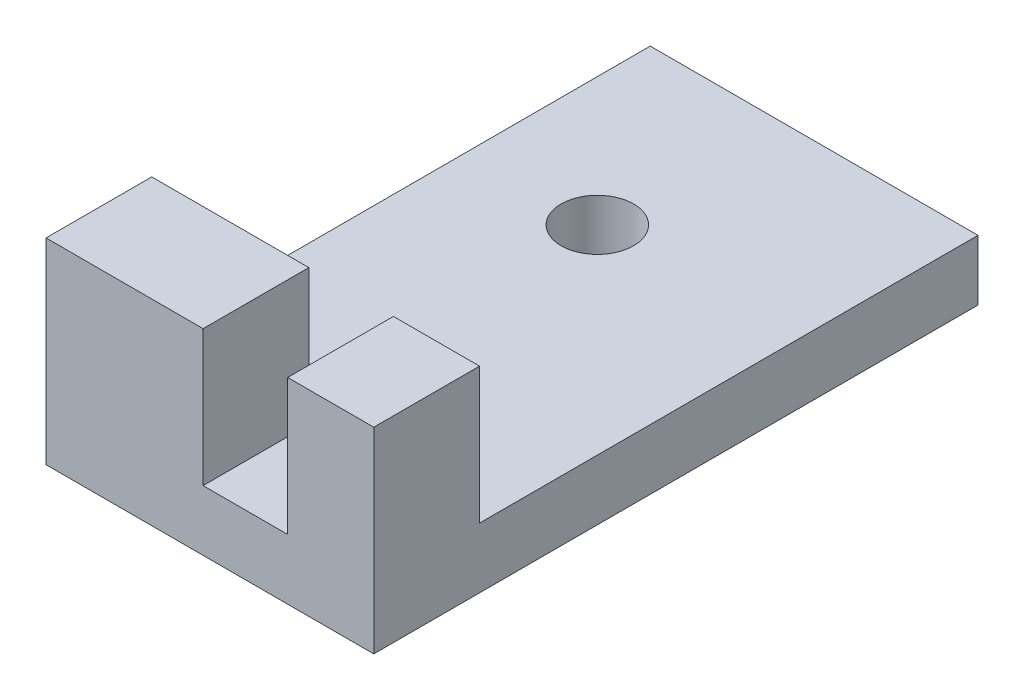
ISO-10303-21;
HEADER;
FILE_DESCRIPTION(('STEP AP214'),'2;1');
FILE_NAME('part.step','',(''),(''),'','','');
FILE_SCHEMA(('AUTOMOTIVE_DESIGN { 1 0 10303 214 1 1 1 1 }'));
ENDSEC;
DATA;
#1=APPLICATION_CONTEXT('core data for automotive mechanical design processes');
#2=APPLICATION_PROTOCOL_DEFINITION('international standard','automotive_design',2000,#1);
#3=PRODUCT_CONTEXT('',#1,'mechanical');
#4=PRODUCT('Part','Part','',(#3));
#5=PRODUCT_RELATED_PRODUCT_CATEGORY('part','',(#4));
#6=PRODUCT_DEFINITION_FORMATION('','',#4);
#7=PRODUCT_DEFINITION_CONTEXT('part definition',#1,'design');
#8=PRODUCT_DEFINITION('design','',#6,#7);
#9=PRODUCT_DEFINITION_SHAPE('','',#8);
#10=(LENGTH_UNIT() NAMED_UNIT(*) SI_UNIT(.MILLI.,.METRE.));
#11=(NAMED_UNIT(*) PLANE_ANGLE_UNIT() SI_UNIT($,.RADIAN.));
#12=(NAMED_UNIT(*) SI_UNIT($,.STERADIAN.) SOLID_ANGLE_UNIT());
#13=UNCERTAINTY_MEASURE_WITH_UNIT(LENGTH_MEASURE(1.E-05),#10,'distance_accuracy_value','');
#14=(GEOMETRIC_REPRESENTATION_CONTEXT(3) GLOBAL_UNCERTAINTY_ASSIGNED_CONTEXT((#13)) GLOBAL_UNIT_ASSIGNED_CONTEXT((#10,
#11,#12)) REPRESENTATION_CONTEXT('',''));
#15=CARTESIAN_POINT('',(0.,0.,0.));
#16=DIRECTION('',(0.,0.,1.));
#17=DIRECTION('',(1.,0.,0.));
#18=AXIS2_PLACEMENT_3D('',#15,#16,#17);
#19=CARTESIAN_POINT('',(0.,13.,0.));
#20=DIRECTION('',(0.,1.,0.));
#21=DIRECTION('',(0.,0.,1.));
#22=AXIS2_PLACEMENT_3D('',#19,#20,#21);
#23=PLANE('',#22);
#24=DIRECTION('',(0.,0.,-1.));
#25=VECTOR('',#24,1.);
#26=CARTESIAN_POINT('',(16.,13.,40.));
#27=LINE('',#26,#25);
#28=CARTESIAN_POINT('',(16.,13.,40.));
#29=VERTEX_POINT('',#28);
#30=CARTESIAN_POINT('',(16.,13.,33.));
#31=VERTEX_POINT('',#30);
#32=EDGE_CURVE('E146',#29,#31,#27,.T.);
#33=ORIENTED_EDGE('',*,*,#32,.F.);
#34=DIRECTION('',(1.,0.,0.));
#35=VECTOR('',#34,1.);
#36=CARTESIAN_POINT('',(0.,13.,40.));
#37=LINE('',#36,#35);
#38=CARTESIAN_POINT('',(21.7,13.,40.));
#39=VERTEX_POINT('',#38);
#40=EDGE_CURVE('E135',#29,#39,#37,.T.);
#41=ORIENTED_EDGE('',*,*,#40,.T.);
#42=DIRECTION('',(0.,0.,-1.));
#43=VECTOR('',#42,1.);
#44=CARTESIAN_POINT('',(21.7,13.,0.));
#45=LINE('',#44,#43);
#46=CARTESIAN_POINT('',(21.7,13.,33.));
#47=VERTEX_POINT('',#46);
#48=EDGE_CURVE('E175',#39,#47,#45,.T.);
#49=ORIENTED_EDGE('',*,*,#48,.T.);
#50=DIRECTION('',(1.,0.,0.));
#51=VECTOR('',#50,1.);
#52=CARTESIAN_POINT('',(0.,13.,33.));
#53=LINE('',#52,#51);
#54=EDGE_CURVE('E148',#31,#47,#53,.T.);
#55=ORIENTED_EDGE('',*,*,#54,.F.);
#56=EDGE_LOOP('',(#33,#41,#49,#55));
#57=FACE_BOUND('',#56,.T.);
#58=ADVANCED_FACE('F37',(#57),#23,.T.);
#59=CARTESIAN_POINT('',(0.,4.,33.));
#60=DIRECTION('',(0.,0.,1.));
#61=DIRECTION('',(1.,0.,0.));
#62=AXIS2_PLACEMENT_3D('',#59,#60,#61);
#63=PLANE('',#62);
#64=DIRECTION('',(1.,0.,0.));
#65=VECTOR('',#64,1.);
#66=CARTESIAN_POINT('',(0.,4.,33.));
#67=LINE('',#66,#65);
#68=CARTESIAN_POINT('',(16.,4.,33.));
#69=VERTEX_POINT('',#68);
#70=CARTESIAN_POINT('',(21.7,4.,33.));
#71=VERTEX_POINT('',#70);
#72=EDGE_CURVE('E155',#69,#71,#67,.T.);
#73=ORIENTED_EDGE('',*,*,#72,.F.);
#74=DIRECTION('',(0.,-1.,0.));
#75=VECTOR('',#74,1.);
#76=CARTESIAN_POINT('',(16.,13.,33.));
#77=LINE('',#76,#75);
#78=EDGE_CURVE('E52',#31,#69,#77,.T.);
#79=ORIENTED_EDGE('',*,*,#78,.F.);
#80=ORIENTED_EDGE('',*,*,#54,.T.);
#81=DIRECTION('',(0.,1.,0.));
#82=VECTOR('',#81,1.);
#83=CARTESIAN_POINT('',(21.7,4.,33.));
#84=LINE('',#83,#82);
#85=EDGE_CURVE('E164',#71,#47,#84,.T.);
#86=ORIENTED_EDGE('',*,*,#85,.F.);
#87=EDGE_LOOP('',(#73,#79,#80,#86));
#88=FACE_BOUND('',#87,.T.);
#89=ADVANCED_FACE('F208',(#88),#63,.F.);
#90=CARTESIAN_POINT('',(0.,13.,0.));
#91=DIRECTION('',(0.,0.,1.));
#92=DIRECTION('',(1.,0.,0.));
#93=AXIS2_PLACEMENT_3D('',#90,#91,#92);
#94=PLANE('',#93);
#95=DIRECTION('',(-1.,0.,0.));
#96=VECTOR('',#95,1.);
#97=CARTESIAN_POINT('',(0.,4.,0.));
#98=LINE('',#97,#96);
#99=CARTESIAN_POINT('',(21.7,4.,0.));
#100=VERTEX_POINT('',#99);
#101=CARTESIAN_POINT('',(0.,4.,0.));
#102=VERTEX_POINT('',#101);
#103=EDGE_CURVE('E161',#100,#102,#98,.T.);
#104=ORIENTED_EDGE('',*,*,#103,.F.);
#105=DIRECTION('',(0.,-1.,0.));
#106=VECTOR('',#105,1.);
#107=CARTESIAN_POINT('',(21.7,13.,0.));
#108=LINE('',#107,#106);
#109=CARTESIAN_POINT('',(21.7,0.,0.));
#110=VERTEX_POINT('',#109);
#111=EDGE_CURVE('E189',#100,#110,#108,.T.);
#112=ORIENTED_EDGE('',*,*,#111,.T.);
#113=DIRECTION('',(-1.,0.,0.));
#114=VECTOR('',#113,1.);
#115=CARTESIAN_POINT('',(0.,0.,0.));
#116=LINE('',#115,#114);
#117=CARTESIAN_POINT('',(0.,0.,0.));
#118=VERTEX_POINT('',#117);
#119=EDGE_CURVE('E171',#110,#118,#116,.T.);
#120=ORIENTED_EDGE('',*,*,#119,.T.);
#121=DIRECTION('',(0.,-1.,0.));
#122=VECTOR('',#121,1.);
#123=CARTESIAN_POINT('',(0.,13.,0.));
#124=LINE('',#123,#122);
#125=EDGE_CURVE('E178',#102,#118,#124,.T.);
#126=ORIENTED_EDGE('',*,*,#125,.F.);
#127=EDGE_LOOP('',(#104,#112,#120,#126));
#128=FACE_BOUND('',#127,.T.);
#129=ADVANCED_FACE('F204',(#128),#94,.F.);
#130=CARTESIAN_POINT('',(0.,13.,0.));
#131=DIRECTION('',(1.,0.,0.));
#132=DIRECTION('',(0.,0.,-1.));
#133=AXIS2_PLACEMENT_3D('',#130,#131,#132);
#134=PLANE('',#133);
#135=DIRECTION('',(0.,0.,1.));
#136=VECTOR('',#135,1.);
#137=CARTESIAN_POINT('',(0.,13.,0.));
#138=LINE('',#137,#136);
#139=CARTESIAN_POINT('',(0.,13.,33.));
#140=VERTEX_POINT('',#139);
#141=CARTESIAN_POINT('',(0.,13.,40.));
#142=VERTEX_POINT('',#141);
#143=EDGE_CURVE('E169',#140,#142,#138,.T.);
#144=ORIENTED_EDGE('',*,*,#143,.F.);
#145=DIRECTION('',(0.,1.,0.));
#146=VECTOR('',#145,1.);
#147=CARTESIAN_POINT('',(0.,4.,33.));
#148=LINE('',#147,#146);
#149=CARTESIAN_POINT('',(0.,4.,33.));
#150=VERTEX_POINT('',#149);
#151=EDGE_CURVE('E60',#150,#140,#148,.T.);
#152=ORIENTED_EDGE('',*,*,#151,.F.);
#153=DIRECTION('',(0.,0.,1.));
#154=VECTOR('',#153,1.);
#155=CARTESIAN_POINT('',(0.,4.,0.));
#156=LINE('',#155,#154);
#157=EDGE_CURVE('E153',#102,#150,#156,.T.);
#158=ORIENTED_EDGE('',*,*,#157,.F.);
#159=ORIENTED_EDGE('',*,*,#125,.T.);
#160=DIRECTION('',(0.,0.,1.));
#161=VECTOR('',#160,1.);
#162=CARTESIAN_POINT('',(0.,0.,0.));
#163=LINE('',#162,#161);
#164=CARTESIAN_POINT('',(0.,0.,40.));
#165=VERTEX_POINT('',#164);
#166=EDGE_CURVE('E167',#118,#165,#163,.T.);
#167=ORIENTED_EDGE('',*,*,#166,.T.);
#168=DIRECTION('',(0.,-1.,0.));
#169=VECTOR('',#168,1.);
#170=CARTESIAN_POINT('',(0.,13.,40.));
#171=LINE('',#170,#169);
#172=EDGE_CURVE('E11',#142,#165,#171,.T.);
#173=ORIENTED_EDGE('',*,*,#172,.F.);
#174=EDGE_LOOP('',(#144,#152,#158,#159,#167,#173));
#175=FACE_BOUND('',#174,.T.);
#176=ADVANCED_FACE('F39',(#175),#134,.F.);
#177=CARTESIAN_POINT('',(0.,13.,40.));
#178=DIRECTION('',(0.,0.,-1.));
#179=DIRECTION('',(-1.,0.,0.));
#180=AXIS2_PLACEMENT_3D('',#177,#178,#179);
#181=PLANE('',#180);
#182=ORIENTED_EDGE('',*,*,#40,.F.);
#183=DIRECTION('',(0.,-1.,0.));
#184=VECTOR('',#183,1.);
#185=CARTESIAN_POINT('',(16.,13.,40.));
#186=LINE('',#185,#184);
#187=CARTESIAN_POINT('',(16.,4.,40.));
#188=VERTEX_POINT('',#187);
#189=EDGE_CURVE('E116',#29,#188,#186,.T.);
#190=ORIENTED_EDGE('',*,*,#189,.T.);
#191=DIRECTION('',(-1.,0.,0.));
#192=VECTOR('',#191,1.);
#193=CARTESIAN_POINT('',(16.,4.,40.));
#194=LINE('',#193,#192);
#195=CARTESIAN_POINT('',(10.4,4.,40.));
#196=VERTEX_POINT('',#195);
#197=EDGE_CURVE('E124',#188,#196,#194,.T.);
#198=ORIENTED_EDGE('',*,*,#197,.T.);
#199=DIRECTION('',(0.,1.,0.));
#200=VECTOR('',#199,1.);
#201=CARTESIAN_POINT('',(10.4,13.,40.));
#202=LINE('',#201,#200);
#203=CARTESIAN_POINT('',(10.4,13.,40.));
#204=VERTEX_POINT('',#203);
#205=EDGE_CURVE('E121',#196,#204,#202,.T.);
#206=ORIENTED_EDGE('',*,*,#205,.T.);
#207=EDGE_CURVE('E172',#142,#204,#37,.T.);
#208=ORIENTED_EDGE('',*,*,#207,.F.);
#209=ORIENTED_EDGE('',*,*,#172,.T.);
#210=DIRECTION('',(1.,0.,0.));
#211=VECTOR('',#210,1.);
#212=CARTESIAN_POINT('',(0.,0.,40.));
#213=LINE('',#212,#211);
#214=CARTESIAN_POINT('',(21.7,0.,40.));
#215=VERTEX_POINT('',#214);
#216=EDGE_CURVE('E181',#165,#215,#213,.T.);
#217=ORIENTED_EDGE('',*,*,#216,.T.);
#218=DIRECTION('',(0.,-1.,0.));
#219=VECTOR('',#218,1.);
#220=CARTESIAN_POINT('',(21.7,13.,40.));
#221=LINE('',#220,#219);
#222=EDGE_CURVE('E45',#39,#215,#221,.T.);
#223=ORIENTED_EDGE('',*,*,#222,.F.);
#224=EDGE_LOOP('',(#182,#190,#198,#206,#208,#209,#217,#223));
#225=FACE_BOUND('',#224,.T.);
#226=ADVANCED_FACE('F133',(#225),#181,.F.);
#227=CARTESIAN_POINT('',(21.7,13.,0.));
#228=DIRECTION('',(-1.,0.,0.));
#229=DIRECTION('',(0.,0.,1.));
#230=AXIS2_PLACEMENT_3D('',#227,#228,#229);
#231=PLANE('',#230);
#232=DIRECTION('',(0.,0.,-1.));
#233=VECTOR('',#232,1.);
#234=CARTESIAN_POINT('',(21.7,4.,0.));
#235=LINE('',#234,#233);
#236=EDGE_CURVE('E159',#71,#100,#235,.T.);
#237=ORIENTED_EDGE('',*,*,#236,.F.);
#238=ORIENTED_EDGE('',*,*,#85,.T.);
#239=ORIENTED_EDGE('',*,*,#48,.F.);
#240=ORIENTED_EDGE('',*,*,#222,.T.);
#241=DIRECTION('',(0.,0.,-1.));
#242=VECTOR('',#241,1.);
#243=CARTESIAN_POINT('',(21.7,0.,0.));
#244=LINE('',#243,#242);
#245=EDGE_CURVE('E183',#215,#110,#244,.T.);
#246=ORIENTED_EDGE('',*,*,#245,.T.);
#247=ORIENTED_EDGE('',*,*,#111,.F.);
#248=EDGE_LOOP('',(#237,#238,#239,#240,#246,#247));
#249=FACE_BOUND('',#248,.T.);
#250=ADVANCED_FACE('F195',(#249),#231,.F.);
#251=DIRECTION('',(0.,0.,-1.));
#252=VECTOR('',#251,1.);
#253=CARTESIAN_POINT('',(10.4,13.,40.));
#254=LINE('',#253,#252);
#255=CARTESIAN_POINT('',(10.4,13.,33.));
#256=VERTEX_POINT('',#255);
#257=EDGE_CURVE('E149',#204,#256,#254,.T.);
#258=ORIENTED_EDGE('',*,*,#257,.T.);
#259=EDGE_CURVE('E156',#140,#256,#53,.T.);
#260=ORIENTED_EDGE('',*,*,#259,.F.);
#261=ORIENTED_EDGE('',*,*,#143,.T.);
#262=ORIENTED_EDGE('',*,*,#207,.T.);
#263=EDGE_LOOP('',(#258,#260,#261,#262));
#264=FACE_BOUND('',#263,.T.);
#265=ADVANCED_FACE('F213',(#264),#23,.T.);
#266=CARTESIAN_POINT('',(0.,0.,0.));
#267=DIRECTION('',(0.,1.,0.));
#268=DIRECTION('',(0.,0.,1.));
#269=AXIS2_PLACEMENT_3D('',#266,#267,#268);
#270=PLANE('',#269);
#271=CARTESIAN_POINT('',(8.50000000000001,0.,12.));
#272=DIRECTION('',(0.,1.,0.));
#273=DIRECTION('',(0.,0.,1.));
#274=AXIS2_PLACEMENT_3D('',#271,#272,#273);
#275=CIRCLE('',#274,2.4);
#276=CARTESIAN_POINT('',(8.50000000000001,0.,14.4));
#277=VERTEX_POINT('',#276);
#278=EDGE_CURVE('E144',#277,#277,#275,.T.);
#279=ORIENTED_EDGE('',*,*,#278,.T.);
#280=EDGE_LOOP('',(#279));
#281=FACE_BOUND('',#280,.T.);
#282=ORIENTED_EDGE('',*,*,#166,.F.);
#283=ORIENTED_EDGE('',*,*,#119,.F.);
#284=ORIENTED_EDGE('',*,*,#245,.F.);
#285=ORIENTED_EDGE('',*,*,#216,.F.);
#286=EDGE_LOOP('',(#282,#283,#284,#285));
#287=FACE_BOUND('',#286,.T.);
#288=ADVANCED_FACE('F200',(#281,#287),#270,.F.);
#289=ORIENTED_EDGE('',*,*,#259,.T.);
#290=DIRECTION('',(0.,1.,0.));
#291=VECTOR('',#290,1.);
#292=CARTESIAN_POINT('',(10.4,13.,33.));
#293=LINE('',#292,#291);
#294=CARTESIAN_POINT('',(10.4,4.,33.));
#295=VERTEX_POINT('',#294);
#296=EDGE_CURVE('E136',#295,#256,#293,.T.);
#297=ORIENTED_EDGE('',*,*,#296,.F.);
#298=EDGE_CURVE('E157',#150,#295,#67,.T.);
#299=ORIENTED_EDGE('',*,*,#298,.F.);
#300=ORIENTED_EDGE('',*,*,#151,.T.);
#301=EDGE_LOOP('',(#289,#297,#299,#300));
#302=FACE_BOUND('',#301,.T.);
#303=ADVANCED_FACE('F218',(#302),#63,.F.);
#304=CARTESIAN_POINT('',(0.,4.,0.));
#305=DIRECTION('',(0.,1.,0.));
#306=DIRECTION('',(0.,0.,1.));
#307=AXIS2_PLACEMENT_3D('',#304,#305,#306);
#308=PLANE('',#307);
#309=CARTESIAN_POINT('',(8.50000000000001,4.,12.));
#310=DIRECTION('',(0.,1.,0.));
#311=DIRECTION('',(0.,0.,1.));
#312=AXIS2_PLACEMENT_3D('',#309,#310,#311);
#313=CIRCLE('',#312,2.4);
#314=CARTESIAN_POINT('',(8.50000000000001,4.,14.4));
#315=VERTEX_POINT('',#314);
#316=EDGE_CURVE('E140',#315,#315,#313,.T.);
#317=ORIENTED_EDGE('',*,*,#316,.F.);
#318=EDGE_LOOP('',(#317));
#319=FACE_BOUND('',#318,.T.);
#320=ORIENTED_EDGE('',*,*,#157,.T.);
#321=ORIENTED_EDGE('',*,*,#298,.T.);
#322=DIRECTION('',(0.,0.,-1.));
#323=VECTOR('',#322,1.);
#324=CARTESIAN_POINT('',(10.4,4.,40.));
#325=LINE('',#324,#323);
#326=EDGE_CURVE('E120',#196,#295,#325,.T.);
#327=ORIENTED_EDGE('',*,*,#326,.F.);
#328=ORIENTED_EDGE('',*,*,#197,.F.);
#329=DIRECTION('',(0.,0.,-1.));
#330=VECTOR('',#329,1.);
#331=CARTESIAN_POINT('',(16.,4.,40.));
#332=LINE('',#331,#330);
#333=EDGE_CURVE('E112',#188,#69,#332,.T.);
#334=ORIENTED_EDGE('',*,*,#333,.T.);
#335=ORIENTED_EDGE('',*,*,#72,.T.);
#336=ORIENTED_EDGE('',*,*,#236,.T.);
#337=ORIENTED_EDGE('',*,*,#103,.T.);
#338=EDGE_LOOP('',(#320,#321,#327,#328,#334,#335,#336,#337));
#339=FACE_BOUND('',#338,.T.);
#340=ADVANCED_FACE('F126',(#319,#339),#308,.T.);
#341=CARTESIAN_POINT('',(16.,13.,40.));
#342=DIRECTION('',(1.,0.,0.));
#343=DIRECTION('',(0.,1.,0.));
#344=AXIS2_PLACEMENT_3D('',#341,#342,#343);
#345=PLANE('',#344);
#346=ORIENTED_EDGE('',*,*,#78,.T.);
#347=ORIENTED_EDGE('',*,*,#333,.F.);
#348=ORIENTED_EDGE('',*,*,#189,.F.);
#349=ORIENTED_EDGE('',*,*,#32,.T.);
#350=EDGE_LOOP('',(#346,#347,#348,#349));
#351=FACE_BOUND('',#350,.T.);
#352=ADVANCED_FACE('F114',(#351),#345,.F.);
#353=CARTESIAN_POINT('',(10.4,13.,40.));
#354=DIRECTION('',(-1.,0.,0.));
#355=DIRECTION('',(0.,0.,1.));
#356=AXIS2_PLACEMENT_3D('',#353,#354,#355);
#357=PLANE('',#356);
#358=ORIENTED_EDGE('',*,*,#296,.T.);
#359=ORIENTED_EDGE('',*,*,#257,.F.);
#360=ORIENTED_EDGE('',*,*,#205,.F.);
#361=ORIENTED_EDGE('',*,*,#326,.T.);
#362=EDGE_LOOP('',(#358,#359,#360,#361));
#363=FACE_BOUND('',#362,.T.);
#364=ADVANCED_FACE('F234',(#363),#357,.F.);
#365=CARTESIAN_POINT('',(8.50000000000001,0.,12.));
#366=DIRECTION('',(0.,1.,0.));
#367=DIRECTION('',(0.,0.,1.));
#368=AXIS2_PLACEMENT_3D('',#365,#366,#367);
#369=CYLINDRICAL_SURFACE('',#368,2.4);
#370=ORIENTED_EDGE('',*,*,#278,.F.);
#371=EDGE_LOOP('',(#370));
#372=FACE_BOUND('',#371,.T.);
#373=ORIENTED_EDGE('',*,*,#316,.T.);
#374=EDGE_LOOP('',(#373));
#375=FACE_BOUND('',#374,.T.);
#376=ADVANCED_FACE('F236',(#372,#375),#369,.F.);
#377=CLOSED_SHELL('',(#58,#89,#129,#176,#226,#250,#265,#288,#303,#340,#352,#364,#376));
#378=MANIFOLD_SOLID_BREP('B2',#377);
#379=ADVANCED_BREP_SHAPE_REPRESENTATION('',(#18,#378),#14);
#380=SHAPE_DEFINITION_REPRESENTATION(#9,#379);
ENDSEC;
END-ISO-10303-21;
